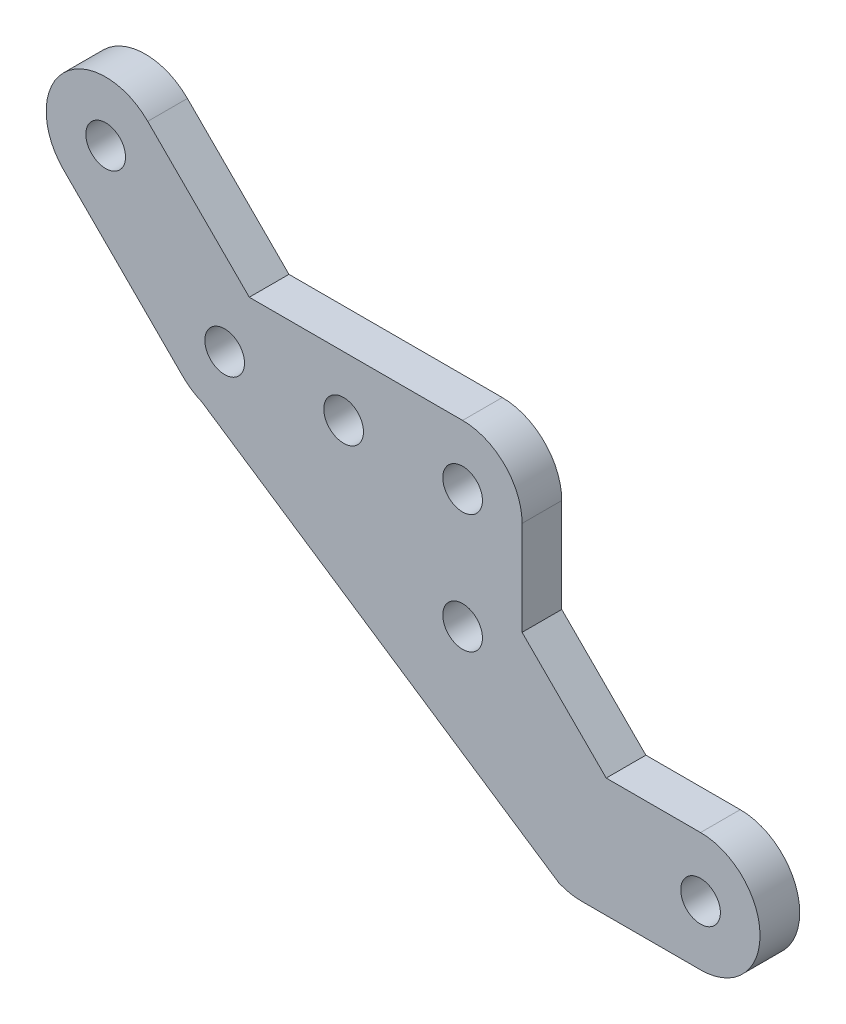
ISO-10303-21;
HEADER;
FILE_DESCRIPTION(('STEP AP214'),'2;1');
FILE_NAME('part.step','',(''),(''),'','','');
FILE_SCHEMA(('AUTOMOTIVE_DESIGN { 1 0 10303 214 1 1 1 1 }'));
ENDSEC;
DATA;
#1=APPLICATION_CONTEXT('core data for automotive mechanical design processes');
#2=APPLICATION_PROTOCOL_DEFINITION('international standard','automotive_design',2000,#1);
#3=PRODUCT_CONTEXT('',#1,'mechanical');
#4=PRODUCT('Part','Part','',(#3));
#5=PRODUCT_RELATED_PRODUCT_CATEGORY('part','',(#4));
#6=PRODUCT_DEFINITION_FORMATION('','',#4);
#7=PRODUCT_DEFINITION_CONTEXT('part definition',#1,'design');
#8=PRODUCT_DEFINITION('design','',#6,#7);
#9=PRODUCT_DEFINITION_SHAPE('','',#8);
#10=(LENGTH_UNIT() NAMED_UNIT(*) SI_UNIT(.MILLI.,.METRE.));
#11=(NAMED_UNIT(*) PLANE_ANGLE_UNIT() SI_UNIT($,.RADIAN.));
#12=(NAMED_UNIT(*) SI_UNIT($,.STERADIAN.) SOLID_ANGLE_UNIT());
#13=UNCERTAINTY_MEASURE_WITH_UNIT(LENGTH_MEASURE(1.E-05),#10,'distance_accuracy_value','');
#14=(GEOMETRIC_REPRESENTATION_CONTEXT(3) GLOBAL_UNCERTAINTY_ASSIGNED_CONTEXT((#13)) GLOBAL_UNIT_ASSIGNED_CONTEXT((#10,
#11,#12)) REPRESENTATION_CONTEXT('',''));
#15=CARTESIAN_POINT('',(0.,0.,0.));
#16=DIRECTION('',(0.,0.,1.));
#17=DIRECTION('',(1.,0.,0.));
#18=AXIS2_PLACEMENT_3D('',#15,#16,#17);
#19=CARTESIAN_POINT('',(195.454456319123,293.181684478685,3.));
#20=DIRECTION('',(0.554700196225229,0.832050294337844,0.));
#21=DIRECTION('',(-0.832050294337844,0.554700196225229,0.));
#22=AXIS2_PLACEMENT_3D('',#19,#20,#21);
#23=PLANE('',#22);
#24=DIRECTION('',(0.832050294337844,-0.554700196225229,0.));
#25=VECTOR('',#24,1.);
#26=CARTESIAN_POINT('',(195.454456319123,293.181684478685,0.));
#27=LINE('',#26,#25);
#28=CARTESIAN_POINT('',(345.2795883828,193.2982631029,0.));
#29=VERTEX_POINT('',#28);
#30=CARTESIAN_POINT('',(372.2795883828,175.2982631029,0.));
#31=VERTEX_POINT('',#30);
#32=EDGE_CURVE('E178',#29,#31,#27,.T.);
#33=ORIENTED_EDGE('',*,*,#32,.T.);
#34=DIRECTION('',(0.,0.,-1.));
#35=VECTOR('',#34,1.);
#36=CARTESIAN_POINT('',(372.2795883828,175.2982631029,3.));
#37=LINE('',#36,#35);
#38=CARTESIAN_POINT('',(372.2795883828,175.2982631029,3.));
#39=VERTEX_POINT('',#38);
#40=EDGE_CURVE('E11',#39,#31,#37,.T.);
#41=ORIENTED_EDGE('',*,*,#40,.F.);
#42=DIRECTION('',(0.832050294337844,-0.554700196225229,0.));
#43=VECTOR('',#42,1.);
#44=CARTESIAN_POINT('',(195.454456319123,293.181684478685,3.));
#45=LINE('',#44,#43);
#46=CARTESIAN_POINT('',(345.2795883828,193.2982631029,3.));
#47=VERTEX_POINT('',#46);
#48=EDGE_CURVE('E222',#47,#39,#45,.T.);
#49=ORIENTED_EDGE('',*,*,#48,.F.);
#50=DIRECTION('',(0.,0.,-1.));
#51=VECTOR('',#50,1.);
#52=CARTESIAN_POINT('',(345.2795883828,193.2982631029,3.));
#53=LINE('',#52,#51);
#54=EDGE_CURVE('E177',#47,#29,#53,.T.);
#55=ORIENTED_EDGE('',*,*,#54,.T.);
#56=EDGE_LOOP('',(#33,#41,#49,#55));
#57=FACE_BOUND('',#56,.T.);
#58=ADVANCED_FACE('F33',(#57),#23,.F.);
#59=CARTESIAN_POINT('',(374.001663828445,179.4557209992,3.));
#60=DIRECTION('',(0.,0.,-1.));
#61=DIRECTION('',(-1.,0.,0.));
#62=AXIS2_PLACEMENT_3D('',#59,#60,#61);
#63=CYLINDRICAL_SURFACE('',#62,4.50000000000003);
#64=CARTESIAN_POINT('',(374.001663828445,179.4557209992,0.));
#65=DIRECTION('',(0.,0.,1.));
#66=DIRECTION('',(1.,0.,0.));
#67=AXIS2_PLACEMENT_3D('',#64,#65,#66);
#68=CIRCLE('',#67,4.50000000000003);
#69=CARTESIAN_POINT('',(374.0016638284,174.9557209992,0.));
#70=VERTEX_POINT('',#69);
#71=EDGE_CURVE('E181',#31,#70,#68,.T.);
#72=ORIENTED_EDGE('',*,*,#71,.T.);
#73=DIRECTION('',(0.,0.,-1.));
#74=VECTOR('',#73,1.);
#75=CARTESIAN_POINT('',(374.0016638284,174.9557209992,3.));
#76=LINE('',#75,#74);
#77=CARTESIAN_POINT('',(374.0016638284,174.9557209992,3.));
#78=VERTEX_POINT('',#77);
#79=EDGE_CURVE('E41',#78,#70,#76,.T.);
#80=ORIENTED_EDGE('',*,*,#79,.F.);
#81=CARTESIAN_POINT('',(374.001663828445,179.4557209992,3.));
#82=DIRECTION('',(0.,0.,1.));
#83=DIRECTION('',(1.,0.,0.));
#84=AXIS2_PLACEMENT_3D('',#81,#82,#83);
#85=CIRCLE('',#84,4.50000000000003);
#86=EDGE_CURVE('E107',#39,#78,#85,.T.);
#87=ORIENTED_EDGE('',*,*,#86,.F.);
#88=ORIENTED_EDGE('',*,*,#40,.T.);
#89=EDGE_LOOP('',(#72,#80,#87,#88));
#90=FACE_BOUND('',#89,.T.);
#91=ADVANCED_FACE('F311',(#90),#63,.T.);
#92=CARTESIAN_POINT('',(0.,174.9557209992,3.));
#93=DIRECTION('',(0.,1.,0.));
#94=DIRECTION('',(0.,0.,1.));
#95=AXIS2_PLACEMENT_3D('',#92,#93,#94);
#96=PLANE('',#95);
#97=DIRECTION('',(1.,0.,0.));
#98=VECTOR('',#97,1.);
#99=CARTESIAN_POINT('',(0.,174.9557209992,0.));
#100=LINE('',#99,#98);
#101=CARTESIAN_POINT('',(383.0016638284,174.9557209992,0.));
#102=VERTEX_POINT('',#101);
#103=EDGE_CURVE('E183',#70,#102,#100,.T.);
#104=ORIENTED_EDGE('',*,*,#103,.T.);
#105=DIRECTION('',(0.,0.,-1.));
#106=VECTOR('',#105,1.);
#107=CARTESIAN_POINT('',(383.0016638284,174.9557209992,3.));
#108=LINE('',#107,#106);
#109=CARTESIAN_POINT('',(383.0016638284,174.9557209992,3.));
#110=VERTEX_POINT('',#109);
#111=EDGE_CURVE('E242',#110,#102,#108,.T.);
#112=ORIENTED_EDGE('',*,*,#111,.F.);
#113=DIRECTION('',(1.,0.,0.));
#114=VECTOR('',#113,1.);
#115=CARTESIAN_POINT('',(0.,174.9557209992,3.));
#116=LINE('',#115,#114);
#117=EDGE_CURVE('E250',#78,#110,#116,.T.);
#118=ORIENTED_EDGE('',*,*,#117,.F.);
#119=ORIENTED_EDGE('',*,*,#79,.T.);
#120=EDGE_LOOP('',(#104,#112,#118,#119));
#121=FACE_BOUND('',#120,.T.);
#122=ADVANCED_FACE('F248',(#121),#96,.F.);
#123=CARTESIAN_POINT('',(383.0016638284,179.4557209992,3.));
#124=DIRECTION('',(0.,0.,-1.));
#125=DIRECTION('',(-1.,0.,0.));
#126=AXIS2_PLACEMENT_3D('',#123,#124,#125);
#127=CYLINDRICAL_SURFACE('',#126,4.49999999999999);
#128=CARTESIAN_POINT('',(383.0016638284,179.4557209992,0.));
#129=DIRECTION('',(0.,0.,1.));
#130=DIRECTION('',(1.,0.,0.));
#131=AXIS2_PLACEMENT_3D('',#128,#129,#130);
#132=CIRCLE('',#131,4.49999999999999);
#133=CARTESIAN_POINT('',(383.0016638284,183.9557209992,0.));
#134=VERTEX_POINT('',#133);
#135=EDGE_CURVE('E185',#102,#134,#132,.T.);
#136=ORIENTED_EDGE('',*,*,#135,.T.);
#137=DIRECTION('',(0.,0.,-1.));
#138=VECTOR('',#137,1.);
#139=CARTESIAN_POINT('',(383.0016638284,183.9557209992,3.));
#140=LINE('',#139,#138);
#141=CARTESIAN_POINT('',(383.0016638284,183.9557209992,3.));
#142=VERTEX_POINT('',#141);
#143=EDGE_CURVE('E239',#142,#134,#140,.T.);
#144=ORIENTED_EDGE('',*,*,#143,.F.);
#145=CARTESIAN_POINT('',(383.0016638284,179.4557209992,3.));
#146=DIRECTION('',(0.,0.,1.));
#147=DIRECTION('',(1.,0.,0.));
#148=AXIS2_PLACEMENT_3D('',#145,#146,#147);
#149=CIRCLE('',#148,4.49999999999999);
#150=EDGE_CURVE('E269',#110,#142,#149,.T.);
#151=ORIENTED_EDGE('',*,*,#150,.F.);
#152=ORIENTED_EDGE('',*,*,#111,.T.);
#153=EDGE_LOOP('',(#136,#144,#151,#152));
#154=FACE_BOUND('',#153,.T.);
#155=ADVANCED_FACE('F260',(#154),#127,.T.);
#156=CARTESIAN_POINT('',(0.,183.9557209992,3.));
#157=DIRECTION('',(0.,-1.,0.));
#158=DIRECTION('',(0.,0.,-1.));
#159=AXIS2_PLACEMENT_3D('',#156,#157,#158);
#160=PLANE('',#159);
#161=DIRECTION('',(-1.,0.,0.));
#162=VECTOR('',#161,1.);
#163=CARTESIAN_POINT('',(0.,183.9557209992,0.));
#164=LINE('',#163,#162);
#165=CARTESIAN_POINT('',(375.8656248591,183.9557209992,0.));
#166=VERTEX_POINT('',#165);
#167=EDGE_CURVE('E187',#134,#166,#164,.T.);
#168=ORIENTED_EDGE('',*,*,#167,.T.);
#169=DIRECTION('',(0.,0.,-1.));
#170=VECTOR('',#169,1.);
#171=CARTESIAN_POINT('',(375.8656248591,183.9557209992,3.));
#172=LINE('',#171,#170);
#173=CARTESIAN_POINT('',(375.8656248591,183.9557209992,3.));
#174=VERTEX_POINT('',#173);
#175=EDGE_CURVE('E236',#174,#166,#172,.T.);
#176=ORIENTED_EDGE('',*,*,#175,.F.);
#177=DIRECTION('',(-1.,0.,0.));
#178=VECTOR('',#177,1.);
#179=CARTESIAN_POINT('',(0.,183.9557209992,3.));
#180=LINE('',#179,#178);
#181=EDGE_CURVE('E266',#142,#174,#180,.T.);
#182=ORIENTED_EDGE('',*,*,#181,.F.);
#183=ORIENTED_EDGE('',*,*,#143,.T.);
#184=EDGE_LOOP('',(#168,#176,#182,#183));
#185=FACE_BOUND('',#184,.T.);
#186=ADVANCED_FACE('F264',(#185),#160,.F.);
#187=CARTESIAN_POINT('',(279.91067292915,279.91067292915,3.));
#188=DIRECTION('',(-0.707106781186547,-0.707106781186547,0.));
#189=DIRECTION('',(0.707106781186548,-0.707106781186548,0.));
#190=AXIS2_PLACEMENT_3D('',#187,#188,#189);
#191=PLANE('',#190);
#192=DIRECTION('',(-0.707106781186548,0.707106781186548,0.));
#193=VECTOR('',#192,1.);
#194=CARTESIAN_POINT('',(279.91067292915,279.91067292915,0.));
#195=LINE('',#194,#193);
#196=CARTESIAN_POINT('',(369.5016638284,190.3196820299,0.));
#197=VERTEX_POINT('',#196);
#198=EDGE_CURVE('E189',#166,#197,#195,.T.);
#199=ORIENTED_EDGE('',*,*,#198,.T.);
#200=DIRECTION('',(0.,0.,-1.));
#201=VECTOR('',#200,1.);
#202=CARTESIAN_POINT('',(369.5016638284,190.3196820299,3.));
#203=LINE('',#202,#201);
#204=CARTESIAN_POINT('',(369.5016638284,190.3196820299,3.));
#205=VERTEX_POINT('',#204);
#206=EDGE_CURVE('E234',#205,#197,#203,.T.);
#207=ORIENTED_EDGE('',*,*,#206,.F.);
#208=DIRECTION('',(-0.707106781186548,0.707106781186548,0.));
#209=VECTOR('',#208,1.);
#210=CARTESIAN_POINT('',(279.91067292915,279.91067292915,3.));
#211=LINE('',#210,#209);
#212=EDGE_CURVE('E268',#174,#205,#211,.T.);
#213=ORIENTED_EDGE('',*,*,#212,.F.);
#214=ORIENTED_EDGE('',*,*,#175,.T.);
#215=EDGE_LOOP('',(#199,#207,#213,#214));
#216=FACE_BOUND('',#215,.T.);
#217=ADVANCED_FACE('F324',(#216),#191,.F.);
#218=CARTESIAN_POINT('',(369.5016638284,0.,3.));
#219=DIRECTION('',(1.,0.,0.));
#220=DIRECTION('',(0.,0.,-1.));
#221=AXIS2_PLACEMENT_3D('',#218,#219,#220);
#222=PLANE('',#221);
#223=DIRECTION('',(0.,-1.,0.));
#224=VECTOR('',#223,1.);
#225=CARTESIAN_POINT('',(369.5016638284,0.,0.));
#226=LINE('',#225,#224);
#227=CARTESIAN_POINT('',(369.5016638284,197.4557209992,0.));
#228=VERTEX_POINT('',#227);
#229=EDGE_CURVE('E192',#228,#197,#226,.T.);
#230=ORIENTED_EDGE('',*,*,#229,.F.);
#231=DIRECTION('',(0.,0.,-1.));
#232=VECTOR('',#231,1.);
#233=CARTESIAN_POINT('',(369.5016638284,197.4557209992,3.));
#234=LINE('',#233,#232);
#235=CARTESIAN_POINT('',(369.5016638284,197.4557209992,3.));
#236=VERTEX_POINT('',#235);
#237=EDGE_CURVE('E232',#236,#228,#234,.T.);
#238=ORIENTED_EDGE('',*,*,#237,.F.);
#239=DIRECTION('',(0.,-1.,0.));
#240=VECTOR('',#239,1.);
#241=CARTESIAN_POINT('',(369.5016638284,0.,3.));
#242=LINE('',#241,#240);
#243=EDGE_CURVE('E271',#236,#205,#242,.T.);
#244=ORIENTED_EDGE('',*,*,#243,.T.);
#245=ORIENTED_EDGE('',*,*,#206,.T.);
#246=EDGE_LOOP('',(#230,#238,#244,#245));
#247=FACE_BOUND('',#246,.T.);
#248=ADVANCED_FACE('F327',(#247),#222,.T.);
#249=CARTESIAN_POINT('',(365.0016638284,197.4557209992,3.));
#250=DIRECTION('',(0.,0.,-1.));
#251=DIRECTION('',(-1.,0.,0.));
#252=AXIS2_PLACEMENT_3D('',#249,#250,#251);
#253=CYLINDRICAL_SURFACE('',#252,4.49999999999998);
#254=CARTESIAN_POINT('',(365.0016638284,197.4557209992,0.));
#255=DIRECTION('',(0.,0.,1.));
#256=DIRECTION('',(1.,0.,0.));
#257=AXIS2_PLACEMENT_3D('',#254,#255,#256);
#258=CIRCLE('',#257,4.49999999999998);
#259=CARTESIAN_POINT('',(365.0016638284,201.9557209992,0.));
#260=VERTEX_POINT('',#259);
#261=EDGE_CURVE('E195',#228,#260,#258,.T.);
#262=ORIENTED_EDGE('',*,*,#261,.T.);
#263=DIRECTION('',(0.,0.,-1.));
#264=VECTOR('',#263,1.);
#265=CARTESIAN_POINT('',(365.0016638284,201.9557209992,3.));
#266=LINE('',#265,#264);
#267=CARTESIAN_POINT('',(365.0016638284,201.9557209992,3.));
#268=VERTEX_POINT('',#267);
#269=EDGE_CURVE('E229',#268,#260,#266,.T.);
#270=ORIENTED_EDGE('',*,*,#269,.F.);
#271=CARTESIAN_POINT('',(365.0016638284,197.4557209992,3.));
#272=DIRECTION('',(0.,0.,1.));
#273=DIRECTION('',(1.,0.,0.));
#274=AXIS2_PLACEMENT_3D('',#271,#272,#273);
#275=CIRCLE('',#274,4.49999999999998);
#276=EDGE_CURVE('E278',#236,#268,#275,.T.);
#277=ORIENTED_EDGE('',*,*,#276,.F.);
#278=ORIENTED_EDGE('',*,*,#237,.T.);
#279=EDGE_LOOP('',(#262,#270,#277,#278));
#280=FACE_BOUND('',#279,.T.);
#281=ADVANCED_FACE('F331',(#280),#253,.T.);
#282=CARTESIAN_POINT('',(0.,201.9557209992,3.));
#283=DIRECTION('',(0.,-1.,0.));
#284=DIRECTION('',(0.,0.,-1.));
#285=AXIS2_PLACEMENT_3D('',#282,#283,#284);
#286=PLANE('',#285);
#287=DIRECTION('',(-1.,0.,0.));
#288=VECTOR('',#287,1.);
#289=CARTESIAN_POINT('',(0.,201.9557209992,0.));
#290=LINE('',#289,#288);
#291=CARTESIAN_POINT('',(348.8656248591,201.9557209992,0.));
#292=VERTEX_POINT('',#291);
#293=EDGE_CURVE('E197',#260,#292,#290,.T.);
#294=ORIENTED_EDGE('',*,*,#293,.T.);
#295=DIRECTION('',(0.,0.,-1.));
#296=VECTOR('',#295,1.);
#297=CARTESIAN_POINT('',(348.8656248591,201.9557209992,3.));
#298=LINE('',#297,#296);
#299=CARTESIAN_POINT('',(348.8656248591,201.9557209992,3.));
#300=VERTEX_POINT('',#299);
#301=EDGE_CURVE('E226',#300,#292,#298,.T.);
#302=ORIENTED_EDGE('',*,*,#301,.F.);
#303=DIRECTION('',(-1.,0.,0.));
#304=VECTOR('',#303,1.);
#305=CARTESIAN_POINT('',(0.,201.9557209992,3.));
#306=LINE('',#305,#304);
#307=EDGE_CURVE('E280',#268,#300,#306,.T.);
#308=ORIENTED_EDGE('',*,*,#307,.F.);
#309=ORIENTED_EDGE('',*,*,#269,.T.);
#310=EDGE_LOOP('',(#294,#302,#308,#309));
#311=FACE_BOUND('',#310,.T.);
#312=ADVANCED_FACE('F287',(#311),#286,.F.);
#313=CARTESIAN_POINT('',(275.410672929149,275.410672929151,3.));
#314=DIRECTION('',(-0.707106781186545,-0.70710678118655,0.));
#315=DIRECTION('',(0.70710678118655,-0.707106781186545,0.));
#316=AXIS2_PLACEMENT_3D('',#313,#314,#315);
#317=PLANE('',#316);
#318=DIRECTION('',(-0.70710678118655,0.707106781186545,0.));
#319=VECTOR('',#318,1.);
#320=CARTESIAN_POINT('',(275.410672929149,275.410672929151,0.));
#321=LINE('',#320,#319);
#322=CARTESIAN_POINT('',(341.1836443438,209.6377015145,0.));
#323=VERTEX_POINT('',#322);
#324=EDGE_CURVE('E199',#292,#323,#321,.T.);
#325=ORIENTED_EDGE('',*,*,#324,.T.);
#326=DIRECTION('',(0.,0.,-1.));
#327=VECTOR('',#326,1.);
#328=CARTESIAN_POINT('',(341.1836443438,209.6377015145,3.));
#329=LINE('',#328,#327);
#330=CARTESIAN_POINT('',(341.1836443438,209.6377015145,3.));
#331=VERTEX_POINT('',#330);
#332=EDGE_CURVE('E151',#331,#323,#329,.T.);
#333=ORIENTED_EDGE('',*,*,#332,.F.);
#334=DIRECTION('',(-0.70710678118655,0.707106781186545,0.));
#335=VECTOR('',#334,1.);
#336=CARTESIAN_POINT('',(275.410672929149,275.410672929151,3.));
#337=LINE('',#336,#335);
#338=EDGE_CURVE('E142',#300,#331,#337,.T.);
#339=ORIENTED_EDGE('',*,*,#338,.F.);
#340=ORIENTED_EDGE('',*,*,#301,.T.);
#341=EDGE_LOOP('',(#325,#333,#339,#340));
#342=FACE_BOUND('',#341,.T.);
#343=ADVANCED_FACE('F291',(#342),#317,.F.);
#344=CARTESIAN_POINT('',(338.00166382845,206.4557209992,3.));
#345=DIRECTION('',(0.,0.,-1.));
#346=DIRECTION('',(-1.,0.,0.));
#347=AXIS2_PLACEMENT_3D('',#344,#345,#346);
#348=CYLINDRICAL_SURFACE('',#347,4.49999999997955);
#349=CARTESIAN_POINT('',(338.00166382845,206.4557209992,0.));
#350=DIRECTION('',(0.,0.,1.));
#351=DIRECTION('',(1.,0.,0.));
#352=AXIS2_PLACEMENT_3D('',#349,#350,#351);
#353=CIRCLE('',#352,4.49999999997955);
#354=CARTESIAN_POINT('',(334.8196833131,203.2737404839,0.));
#355=VERTEX_POINT('',#354);
#356=EDGE_CURVE('E150',#323,#355,#353,.T.);
#357=ORIENTED_EDGE('',*,*,#356,.T.);
#358=DIRECTION('',(0.,0.,-1.));
#359=VECTOR('',#358,1.);
#360=CARTESIAN_POINT('',(334.8196833131,203.2737404839,3.));
#361=LINE('',#360,#359);
#362=CARTESIAN_POINT('',(334.8196833131,203.2737404839,3.));
#363=VERTEX_POINT('',#362);
#364=EDGE_CURVE('E147',#363,#355,#361,.T.);
#365=ORIENTED_EDGE('',*,*,#364,.F.);
#366=CARTESIAN_POINT('',(338.00166382845,206.4557209992,3.));
#367=DIRECTION('',(0.,0.,1.));
#368=DIRECTION('',(1.,0.,0.));
#369=AXIS2_PLACEMENT_3D('',#366,#367,#368);
#370=CIRCLE('',#369,4.49999999997955);
#371=EDGE_CURVE('E135',#331,#363,#370,.T.);
#372=ORIENTED_EDGE('',*,*,#371,.F.);
#373=ORIENTED_EDGE('',*,*,#332,.T.);
#374=EDGE_LOOP('',(#357,#365,#372,#373));
#375=FACE_BOUND('',#374,.T.);
#376=ADVANCED_FACE('F148',(#375),#348,.T.);
#377=CARTESIAN_POINT('',(269.0467118985,269.0467118985,3.));
#378=DIRECTION('',(0.707106781186547,0.707106781186547,0.));
#379=DIRECTION('',(-0.707106781186548,0.707106781186548,0.));
#380=AXIS2_PLACEMENT_3D('',#377,#378,#379);
#381=PLANE('',#380);
#382=DIRECTION('',(0.707106781186548,-0.707106781186548,0.));
#383=VECTOR('',#382,1.);
#384=CARTESIAN_POINT('',(269.0467118985,269.0467118985,0.));
#385=LINE('',#384,#383);
#386=CARTESIAN_POINT('',(343.8196833131,194.2737404839,0.));
#387=VERTEX_POINT('',#386);
#388=EDGE_CURVE('E93',#355,#387,#385,.T.);
#389=ORIENTED_EDGE('',*,*,#388,.T.);
#390=DIRECTION('',(0.,0.,-1.));
#391=VECTOR('',#390,1.);
#392=CARTESIAN_POINT('',(343.8196833131,194.2737404839,3.));
#393=LINE('',#392,#391);
#394=CARTESIAN_POINT('',(343.8196833131,194.2737404839,3.));
#395=VERTEX_POINT('',#394);
#396=EDGE_CURVE('E152',#395,#387,#393,.T.);
#397=ORIENTED_EDGE('',*,*,#396,.F.);
#398=DIRECTION('',(0.707106781186548,-0.707106781186548,0.));
#399=VECTOR('',#398,1.);
#400=CARTESIAN_POINT('',(269.0467118985,269.0467118985,3.));
#401=LINE('',#400,#399);
#402=EDGE_CURVE('E140',#363,#395,#401,.T.);
#403=ORIENTED_EDGE('',*,*,#402,.F.);
#404=ORIENTED_EDGE('',*,*,#364,.T.);
#405=EDGE_LOOP('',(#389,#397,#403,#404));
#406=FACE_BOUND('',#405,.T.);
#407=ADVANCED_FACE('F154',(#406),#381,.F.);
#408=CARTESIAN_POINT('',(383.0016638284,179.4557209992,3.));
#409=DIRECTION('',(0.,0.,-1.));
#410=DIRECTION('',(-1.,0.,0.));
#411=AXIS2_PLACEMENT_3D('',#408,#409,#410);
#412=CYLINDRICAL_SURFACE('',#411,1.5);
#413=CARTESIAN_POINT('',(383.0016638284,179.4557209992,3.));
#414=DIRECTION('',(0.,0.,1.));
#415=DIRECTION('',(1.,0.,0.));
#416=AXIS2_PLACEMENT_3D('',#413,#414,#415);
#417=CIRCLE('',#416,1.5);
#418=CARTESIAN_POINT('',(384.5016638284,179.4557209992,3.));
#419=VERTEX_POINT('',#418);
#420=EDGE_CURVE('E171',#419,#419,#417,.T.);
#421=ORIENTED_EDGE('',*,*,#420,.T.);
#422=EDGE_LOOP('',(#421));
#423=FACE_BOUND('',#422,.T.);
#424=CARTESIAN_POINT('',(383.0016638284,179.4557209992,0.));
#425=DIRECTION('',(0.,0.,1.));
#426=DIRECTION('',(1.,0.,0.));
#427=AXIS2_PLACEMENT_3D('',#424,#425,#426);
#428=CIRCLE('',#427,1.5);
#429=CARTESIAN_POINT('',(384.5016638284,179.4557209992,0.));
#430=VERTEX_POINT('',#429);
#431=EDGE_CURVE('E216',#430,#430,#428,.T.);
#432=ORIENTED_EDGE('',*,*,#431,.F.);
#433=EDGE_LOOP('',(#432));
#434=FACE_BOUND('',#433,.T.);
#435=ADVANCED_FACE('F342',(#423,#434),#412,.F.);
#436=CARTESIAN_POINT('',(356.0016638284,197.4557209992,3.));
#437=DIRECTION('',(0.,0.,-1.));
#438=DIRECTION('',(-1.,0.,0.));
#439=AXIS2_PLACEMENT_3D('',#436,#437,#438);
#440=CYLINDRICAL_SURFACE('',#439,1.5);
#441=CARTESIAN_POINT('',(356.0016638284,197.4557209992,3.));
#442=DIRECTION('',(0.,0.,1.));
#443=DIRECTION('',(1.,0.,0.));
#444=AXIS2_PLACEMENT_3D('',#441,#442,#443);
#445=CIRCLE('',#444,1.5);
#446=CARTESIAN_POINT('',(357.5016638284,197.4557209992,3.));
#447=VERTEX_POINT('',#446);
#448=EDGE_CURVE('E168',#447,#447,#445,.T.);
#449=ORIENTED_EDGE('',*,*,#448,.T.);
#450=EDGE_LOOP('',(#449));
#451=FACE_BOUND('',#450,.T.);
#452=CARTESIAN_POINT('',(356.0016638284,197.4557209992,0.));
#453=DIRECTION('',(0.,0.,1.));
#454=DIRECTION('',(1.,0.,0.));
#455=AXIS2_PLACEMENT_3D('',#452,#453,#454);
#456=CIRCLE('',#455,1.5);
#457=CARTESIAN_POINT('',(357.5016638284,197.4557209992,0.));
#458=VERTEX_POINT('',#457);
#459=EDGE_CURVE('E213',#458,#458,#456,.T.);
#460=ORIENTED_EDGE('',*,*,#459,.F.);
#461=EDGE_LOOP('',(#460));
#462=FACE_BOUND('',#461,.T.);
#463=ADVANCED_FACE('F346',(#451,#462),#440,.F.);
#464=CARTESIAN_POINT('',(365.0016638284,188.4557209992,3.));
#465=DIRECTION('',(0.,0.,-1.));
#466=DIRECTION('',(-1.,0.,0.));
#467=AXIS2_PLACEMENT_3D('',#464,#465,#466);
#468=CYLINDRICAL_SURFACE('',#467,1.5);
#469=CARTESIAN_POINT('',(365.0016638284,188.4557209992,3.));
#470=DIRECTION('',(0.,0.,1.));
#471=DIRECTION('',(1.,0.,0.));
#472=AXIS2_PLACEMENT_3D('',#469,#470,#471);
#473=CIRCLE('',#472,1.5);
#474=CARTESIAN_POINT('',(366.5016638284,188.4557209992,3.));
#475=VERTEX_POINT('',#474);
#476=EDGE_CURVE('E165',#475,#475,#473,.T.);
#477=ORIENTED_EDGE('',*,*,#476,.T.);
#478=EDGE_LOOP('',(#477));
#479=FACE_BOUND('',#478,.T.);
#480=CARTESIAN_POINT('',(365.0016638284,188.4557209992,0.));
#481=DIRECTION('',(0.,0.,1.));
#482=DIRECTION('',(1.,0.,0.));
#483=AXIS2_PLACEMENT_3D('',#480,#481,#482);
#484=CIRCLE('',#483,1.5);
#485=CARTESIAN_POINT('',(366.5016638284,188.4557209992,0.));
#486=VERTEX_POINT('',#485);
#487=EDGE_CURVE('E210',#486,#486,#484,.T.);
#488=ORIENTED_EDGE('',*,*,#487,.F.);
#489=EDGE_LOOP('',(#488));
#490=FACE_BOUND('',#489,.T.);
#491=ADVANCED_FACE('F352',(#479,#490),#468,.F.);
#492=CARTESIAN_POINT('',(338.00166382845,206.4557209992,3.));
#493=DIRECTION('',(0.,0.,-1.));
#494=DIRECTION('',(-1.,0.,0.));
#495=AXIS2_PLACEMENT_3D('',#492,#493,#494);
#496=CYLINDRICAL_SURFACE('',#495,1.49999999995004);
#497=CARTESIAN_POINT('',(338.00166382845,206.4557209992,3.));
#498=DIRECTION('',(0.,0.,1.));
#499=DIRECTION('',(1.,0.,0.));
#500=AXIS2_PLACEMENT_3D('',#497,#498,#499);
#501=CIRCLE('',#500,1.49999999995004);
#502=CARTESIAN_POINT('',(339.5016638284,206.4557209992,3.));
#503=VERTEX_POINT('',#502);
#504=EDGE_CURVE('E162',#503,#503,#501,.T.);
#505=ORIENTED_EDGE('',*,*,#504,.T.);
#506=EDGE_LOOP('',(#505));
#507=FACE_BOUND('',#506,.T.);
#508=CARTESIAN_POINT('',(338.00166382845,206.4557209992,0.));
#509=DIRECTION('',(0.,0.,1.));
#510=DIRECTION('',(1.,0.,0.));
#511=AXIS2_PLACEMENT_3D('',#508,#509,#510);
#512=CIRCLE('',#511,1.49999999995004);
#513=CARTESIAN_POINT('',(339.5016638284,206.4557209992,0.));
#514=VERTEX_POINT('',#513);
#515=EDGE_CURVE('E207',#514,#514,#512,.T.);
#516=ORIENTED_EDGE('',*,*,#515,.F.);
#517=EDGE_LOOP('',(#516));
#518=FACE_BOUND('',#517,.T.);
#519=ADVANCED_FACE('F306',(#507,#518),#496,.F.);
#520=CARTESIAN_POINT('',(347.001663828503,197.455720999176,3.));
#521=DIRECTION('',(0.,0.,-1.));
#522=DIRECTION('',(-1.,0.,0.));
#523=AXIS2_PLACEMENT_3D('',#520,#521,#522);
#524=CYLINDRICAL_SURFACE('',#523,1.49999999989697);
#525=CARTESIAN_POINT('',(347.001663828503,197.455720999176,3.));
#526=DIRECTION('',(0.,0.,1.));
#527=DIRECTION('',(1.,0.,0.));
#528=AXIS2_PLACEMENT_3D('',#525,#526,#527);
#529=CIRCLE('',#528,1.49999999989697);
#530=CARTESIAN_POINT('',(348.5016638284,197.455720999176,3.));
#531=VERTEX_POINT('',#530);
#532=EDGE_CURVE('E156',#531,#531,#529,.T.);
#533=ORIENTED_EDGE('',*,*,#532,.T.);
#534=EDGE_LOOP('',(#533));
#535=FACE_BOUND('',#534,.T.);
#536=CARTESIAN_POINT('',(347.001663828503,197.455720999176,0.));
#537=DIRECTION('',(0.,0.,1.));
#538=DIRECTION('',(1.,0.,0.));
#539=AXIS2_PLACEMENT_3D('',#536,#537,#538);
#540=CIRCLE('',#539,1.49999999989697);
#541=CARTESIAN_POINT('',(348.5016638284,197.455720999176,0.));
#542=VERTEX_POINT('',#541);
#543=EDGE_CURVE('E204',#542,#542,#540,.T.);
#544=ORIENTED_EDGE('',*,*,#543,.F.);
#545=EDGE_LOOP('',(#544));
#546=FACE_BOUND('',#545,.T.);
#547=ADVANCED_FACE('F298',(#535,#546),#524,.F.);
#548=CARTESIAN_POINT('',(347.001663828503,197.455720999176,3.));
#549=DIRECTION('',(0.,0.,-1.));
#550=DIRECTION('',(-1.,0.,0.));
#551=AXIS2_PLACEMENT_3D('',#548,#549,#550);
#552=CYLINDRICAL_SURFACE('',#551,4.50000000000005);
#553=CARTESIAN_POINT('',(347.001663828503,197.455720999176,0.));
#554=DIRECTION('',(0.,0.,1.));
#555=DIRECTION('',(1.,0.,0.));
#556=AXIS2_PLACEMENT_3D('',#553,#554,#555);
#557=CIRCLE('',#556,4.50000000000005);
#558=EDGE_CURVE('E99',#387,#29,#557,.T.);
#559=ORIENTED_EDGE('',*,*,#558,.T.);
#560=ORIENTED_EDGE('',*,*,#54,.F.);
#561=CARTESIAN_POINT('',(347.001663828503,197.455720999176,3.));
#562=DIRECTION('',(0.,0.,1.));
#563=DIRECTION('',(1.,0.,0.));
#564=AXIS2_PLACEMENT_3D('',#561,#562,#563);
#565=CIRCLE('',#564,4.50000000000005);
#566=EDGE_CURVE('E49',#395,#47,#565,.T.);
#567=ORIENTED_EDGE('',*,*,#566,.F.);
#568=ORIENTED_EDGE('',*,*,#396,.T.);
#569=EDGE_LOOP('',(#559,#560,#567,#568));
#570=FACE_BOUND('',#569,.T.);
#571=ADVANCED_FACE('F295',(#570),#552,.T.);
#572=CARTESIAN_POINT('',(365.0016638284,197.4557209992,3.));
#573=DIRECTION('',(0.,0.,-1.));
#574=DIRECTION('',(-1.,0.,0.));
#575=AXIS2_PLACEMENT_3D('',#572,#573,#574);
#576=CYLINDRICAL_SURFACE('',#575,1.5);
#577=CARTESIAN_POINT('',(365.0016638284,197.4557209992,3.));
#578=DIRECTION('',(0.,0.,1.));
#579=DIRECTION('',(1.,0.,0.));
#580=AXIS2_PLACEMENT_3D('',#577,#578,#579);
#581=CIRCLE('',#580,1.5);
#582=CARTESIAN_POINT('',(366.5016638284,197.4557209992,3.));
#583=VERTEX_POINT('',#582);
#584=EDGE_CURVE('E174',#583,#583,#581,.T.);
#585=ORIENTED_EDGE('',*,*,#584,.T.);
#586=EDGE_LOOP('',(#585));
#587=FACE_BOUND('',#586,.T.);
#588=CARTESIAN_POINT('',(365.0016638284,197.4557209992,0.));
#589=DIRECTION('',(0.,0.,1.));
#590=DIRECTION('',(1.,0.,0.));
#591=AXIS2_PLACEMENT_3D('',#588,#589,#590);
#592=CIRCLE('',#591,1.5);
#593=CARTESIAN_POINT('',(366.5016638284,197.4557209992,0.));
#594=VERTEX_POINT('',#593);
#595=EDGE_CURVE('E219',#594,#594,#592,.T.);
#596=ORIENTED_EDGE('',*,*,#595,.F.);
#597=EDGE_LOOP('',(#596));
#598=FACE_BOUND('',#597,.T.);
#599=ADVANCED_FACE('F297',(#587,#598),#576,.F.);
#600=CARTESIAN_POINT('',(0.,0.,3.));
#601=DIRECTION('',(0.,0.,1.));
#602=DIRECTION('',(1.,0.,0.));
#603=AXIS2_PLACEMENT_3D('',#600,#601,#602);
#604=PLANE('',#603);
#605=ORIENTED_EDGE('',*,*,#48,.T.);
#606=ORIENTED_EDGE('',*,*,#86,.T.);
#607=ORIENTED_EDGE('',*,*,#117,.T.);
#608=ORIENTED_EDGE('',*,*,#150,.T.);
#609=ORIENTED_EDGE('',*,*,#181,.T.);
#610=ORIENTED_EDGE('',*,*,#212,.T.);
#611=ORIENTED_EDGE('',*,*,#243,.F.);
#612=ORIENTED_EDGE('',*,*,#276,.T.);
#613=ORIENTED_EDGE('',*,*,#307,.T.);
#614=ORIENTED_EDGE('',*,*,#338,.T.);
#615=ORIENTED_EDGE('',*,*,#371,.T.);
#616=ORIENTED_EDGE('',*,*,#402,.T.);
#617=ORIENTED_EDGE('',*,*,#566,.T.);
#618=EDGE_LOOP('',(#605,#606,#607,#608,#609,#610,#611,#612,#613,#614,#615,#616,#617));
#619=FACE_BOUND('',#618,.T.);
#620=ORIENTED_EDGE('',*,*,#532,.F.);
#621=EDGE_LOOP('',(#620));
#622=FACE_BOUND('',#621,.T.);
#623=ORIENTED_EDGE('',*,*,#504,.F.);
#624=EDGE_LOOP('',(#623));
#625=FACE_BOUND('',#624,.T.);
#626=ORIENTED_EDGE('',*,*,#476,.F.);
#627=EDGE_LOOP('',(#626));
#628=FACE_BOUND('',#627,.T.);
#629=ORIENTED_EDGE('',*,*,#448,.F.);
#630=EDGE_LOOP('',(#629));
#631=FACE_BOUND('',#630,.T.);
#632=ORIENTED_EDGE('',*,*,#420,.F.);
#633=EDGE_LOOP('',(#632));
#634=FACE_BOUND('',#633,.T.);
#635=ORIENTED_EDGE('',*,*,#584,.F.);
#636=EDGE_LOOP('',(#635));
#637=FACE_BOUND('',#636,.T.);
#638=ADVANCED_FACE('F137',(#619,#622,#625,#628,#631,#634,#637),#604,.T.);
#639=CARTESIAN_POINT('',(0.,0.,0.));
#640=DIRECTION('',(0.,0.,1.));
#641=DIRECTION('',(1.,0.,0.));
#642=AXIS2_PLACEMENT_3D('',#639,#640,#641);
#643=PLANE('',#642);
#644=ORIENTED_EDGE('',*,*,#32,.F.);
#645=ORIENTED_EDGE('',*,*,#558,.F.);
#646=ORIENTED_EDGE('',*,*,#388,.F.);
#647=ORIENTED_EDGE('',*,*,#356,.F.);
#648=ORIENTED_EDGE('',*,*,#324,.F.);
#649=ORIENTED_EDGE('',*,*,#293,.F.);
#650=ORIENTED_EDGE('',*,*,#261,.F.);
#651=ORIENTED_EDGE('',*,*,#229,.T.);
#652=ORIENTED_EDGE('',*,*,#198,.F.);
#653=ORIENTED_EDGE('',*,*,#167,.F.);
#654=ORIENTED_EDGE('',*,*,#135,.F.);
#655=ORIENTED_EDGE('',*,*,#103,.F.);
#656=ORIENTED_EDGE('',*,*,#71,.F.);
#657=EDGE_LOOP('',(#644,#645,#646,#647,#648,#649,#650,#651,#652,#653,#654,#655,#656));
#658=FACE_BOUND('',#657,.T.);
#659=ORIENTED_EDGE('',*,*,#543,.T.);
#660=EDGE_LOOP('',(#659));
#661=FACE_BOUND('',#660,.T.);
#662=ORIENTED_EDGE('',*,*,#515,.T.);
#663=EDGE_LOOP('',(#662));
#664=FACE_BOUND('',#663,.T.);
#665=ORIENTED_EDGE('',*,*,#487,.T.);
#666=EDGE_LOOP('',(#665));
#667=FACE_BOUND('',#666,.T.);
#668=ORIENTED_EDGE('',*,*,#459,.T.);
#669=EDGE_LOOP('',(#668));
#670=FACE_BOUND('',#669,.T.);
#671=ORIENTED_EDGE('',*,*,#431,.T.);
#672=EDGE_LOOP('',(#671));
#673=FACE_BOUND('',#672,.T.);
#674=ORIENTED_EDGE('',*,*,#595,.T.);
#675=EDGE_LOOP('',(#674));
#676=FACE_BOUND('',#675,.T.);
#677=ADVANCED_FACE('F254',(#658,#661,#664,#667,#670,#673,#676),#643,.F.);
#678=CLOSED_SHELL('',(#58,#91,#122,#155,#186,#217,#248,#281,#312,#343,#376,#407,#435,#463,#491,
#519,#547,#571,#599,#638,#677));
#679=MANIFOLD_SOLID_BREP('B2',#678);
#680=ADVANCED_BREP_SHAPE_REPRESENTATION('',(#18,#679),#14);
#681=SHAPE_DEFINITION_REPRESENTATION(#9,#680);
ENDSEC;
END-ISO-10303-21;
